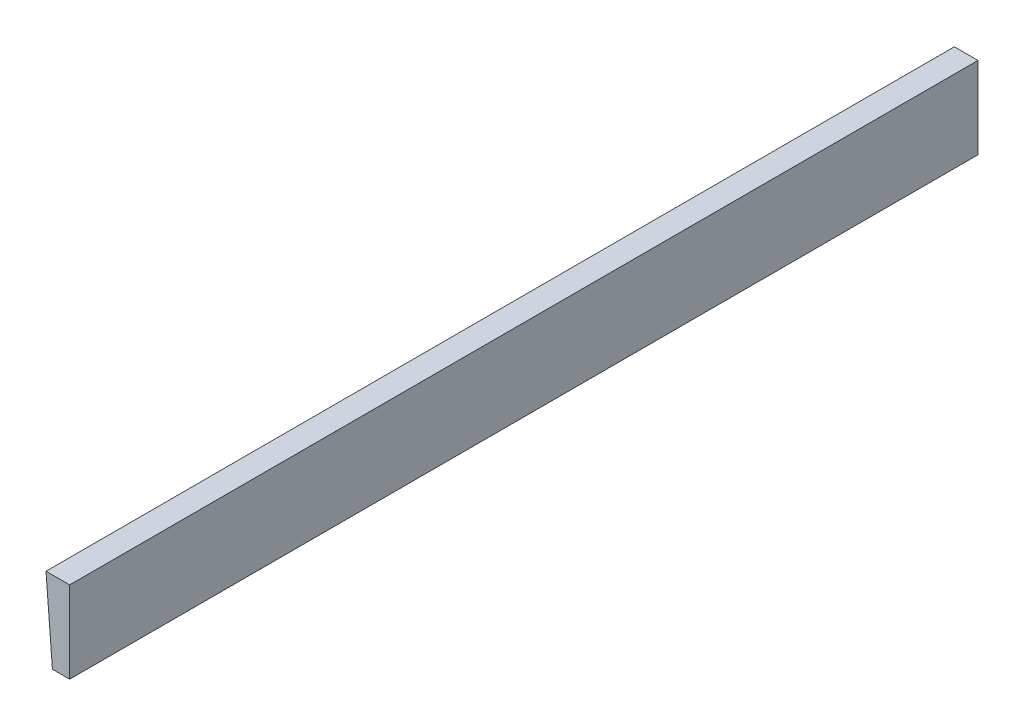
ISO-10303-21;
HEADER;
FILE_DESCRIPTION(('STEP AP214'),'2;1');
FILE_NAME('part.step','',(''),(''),'','','');
FILE_SCHEMA(('AUTOMOTIVE_DESIGN { 1 0 10303 214 1 1 1 1 }'));
ENDSEC;
DATA;
#1=APPLICATION_CONTEXT('core data for automotive mechanical design processes');
#2=APPLICATION_PROTOCOL_DEFINITION('international standard','automotive_design',2000,#1);
#3=PRODUCT_CONTEXT('',#1,'mechanical');
#4=PRODUCT('Part','Part','',(#3));
#5=PRODUCT_RELATED_PRODUCT_CATEGORY('part','',(#4));
#6=PRODUCT_DEFINITION_FORMATION('','',#4);
#7=PRODUCT_DEFINITION_CONTEXT('part definition',#1,'design');
#8=PRODUCT_DEFINITION('design','',#6,#7);
#9=PRODUCT_DEFINITION_SHAPE('','',#8);
#10=(LENGTH_UNIT() NAMED_UNIT(*) SI_UNIT(.MILLI.,.METRE.));
#11=(NAMED_UNIT(*) PLANE_ANGLE_UNIT() SI_UNIT($,.RADIAN.));
#12=(NAMED_UNIT(*) SI_UNIT($,.STERADIAN.) SOLID_ANGLE_UNIT());
#13=UNCERTAINTY_MEASURE_WITH_UNIT(LENGTH_MEASURE(1.E-05),#10,'distance_accuracy_value','');
#14=(GEOMETRIC_REPRESENTATION_CONTEXT(3) GLOBAL_UNCERTAINTY_ASSIGNED_CONTEXT((#13)) GLOBAL_UNIT_ASSIGNED_CONTEXT((#10,
#11,#12)) REPRESENTATION_CONTEXT('',''));
#15=CARTESIAN_POINT('',(0.,0.,0.));
#16=DIRECTION('',(0.,0.,1.));
#17=DIRECTION('',(1.,0.,0.));
#18=AXIS2_PLACEMENT_3D('',#15,#16,#17);
#19=CARTESIAN_POINT('',(0.,0.,-111.1875));
#20=DIRECTION('',(1.,0.,0.));
#21=DIRECTION('',(0.,0.,-1.));
#22=AXIS2_PLACEMENT_3D('',#19,#20,#21);
#23=PLANE('',#22);
#24=DIRECTION('',(0.,1.,0.));
#25=VECTOR('',#24,1.);
#26=CARTESIAN_POINT('',(0.,0.,111.1875));
#27=LINE('',#26,#25);
#28=CARTESIAN_POINT('',(0.,0.,111.1875));
#29=VERTEX_POINT('',#28);
#30=CARTESIAN_POINT('',(0.,20.,111.1875));
#31=VERTEX_POINT('',#30);
#32=EDGE_CURVE('E99',#29,#31,#27,.T.);
#33=ORIENTED_EDGE('',*,*,#32,.F.);
#34=DIRECTION('',(0.,0.,1.));
#35=VECTOR('',#34,1.);
#36=CARTESIAN_POINT('',(0.,0.,-111.1875));
#37=LINE('',#36,#35);
#38=CARTESIAN_POINT('',(0.,0.,-111.1875));
#39=VERTEX_POINT('',#38);
#40=EDGE_CURVE('E11',#39,#29,#37,.T.);
#41=ORIENTED_EDGE('',*,*,#40,.F.);
#42=DIRECTION('',(0.,1.,0.));
#43=VECTOR('',#42,1.);
#44=CARTESIAN_POINT('',(0.,10.,-111.1875));
#45=LINE('',#44,#43);
#46=CARTESIAN_POINT('',(0.,20.,-111.1875));
#47=VERTEX_POINT('',#46);
#48=EDGE_CURVE('E58',#39,#47,#45,.T.);
#49=ORIENTED_EDGE('',*,*,#48,.T.);
#50=DIRECTION('',(0.,0.,1.));
#51=VECTOR('',#50,1.);
#52=CARTESIAN_POINT('',(0.,20.,-111.1875));
#53=LINE('',#52,#51);
#54=EDGE_CURVE('E43',#47,#31,#53,.T.);
#55=ORIENTED_EDGE('',*,*,#54,.T.);
#56=EDGE_LOOP('',(#33,#41,#49,#55));
#57=FACE_BOUND('',#56,.T.);
#58=ADVANCED_FACE('F39',(#57),#23,.T.);
#59=CARTESIAN_POINT('',(-4.21298293175389,0.,-111.1875));
#60=DIRECTION('',(0.,-1.,0.));
#61=DIRECTION('',(1.,0.,0.));
#62=AXIS2_PLACEMENT_3D('',#59,#60,#61);
#63=PLANE('',#62);
#64=DIRECTION('',(1.,0.,0.));
#65=VECTOR('',#64,1.);
#66=CARTESIAN_POINT('',(-4.21298293175389,0.,111.1875));
#67=LINE('',#66,#65);
#68=CARTESIAN_POINT('',(-4.21298293175389,0.,111.1875));
#69=VERTEX_POINT('',#68);
#70=EDGE_CURVE('E106',#69,#29,#67,.T.);
#71=ORIENTED_EDGE('',*,*,#70,.F.);
#72=DIRECTION('',(0.,0.,1.));
#73=VECTOR('',#72,1.);
#74=CARTESIAN_POINT('',(-4.21298293175389,0.,-111.1875));
#75=LINE('',#74,#73);
#76=CARTESIAN_POINT('',(-4.21298293175389,0.,-111.1875));
#77=VERTEX_POINT('',#76);
#78=EDGE_CURVE('E49',#77,#69,#75,.T.);
#79=ORIENTED_EDGE('',*,*,#78,.F.);
#80=DIRECTION('',(1.,0.,0.));
#81=VECTOR('',#80,1.);
#82=CARTESIAN_POINT('',(-4.21298293175389,0.,-111.1875));
#83=LINE('',#82,#81);
#84=EDGE_CURVE('E96',#77,#39,#83,.T.);
#85=ORIENTED_EDGE('',*,*,#84,.T.);
#86=ORIENTED_EDGE('',*,*,#40,.T.);
#87=EDGE_LOOP('',(#71,#79,#85,#86));
#88=FACE_BOUND('',#87,.T.);
#89=ADVANCED_FACE('F113',(#88),#63,.T.);
#90=CARTESIAN_POINT('',(-5.,10.,-111.1875));
#91=DIRECTION('',(-0.996917333733129,-0.0784590957278379,0.));
#92=DIRECTION('',(0.0784590957278379,-0.996917333733129,0.));
#93=AXIS2_PLACEMENT_3D('',#90,#91,#92);
#94=PLANE('',#93);
#95=DIRECTION('',(0.0784590957278379,-0.996917333733128,0.));
#96=VECTOR('',#95,1.);
#97=CARTESIAN_POINT('',(-5.,10.,111.1875));
#98=LINE('',#97,#96);
#99=CARTESIAN_POINT('',(-5.78701706824611,20.,111.1875));
#100=VERTEX_POINT('',#99);
#101=EDGE_CURVE('E92',#100,#69,#98,.T.);
#102=ORIENTED_EDGE('',*,*,#101,.F.);
#103=DIRECTION('',(0.,0.,1.));
#104=VECTOR('',#103,1.);
#105=CARTESIAN_POINT('',(-5.78701706824611,20.,-111.1875));
#106=LINE('',#105,#104);
#107=CARTESIAN_POINT('',(-5.78701706824611,20.,-111.1875));
#108=VERTEX_POINT('',#107);
#109=EDGE_CURVE('E87',#108,#100,#106,.T.);
#110=ORIENTED_EDGE('',*,*,#109,.F.);
#111=DIRECTION('',(0.0784590957278379,-0.996917333733128,0.));
#112=VECTOR('',#111,1.);
#113=CARTESIAN_POINT('',(-5.78701706824611,20.,-111.1875));
#114=LINE('',#113,#112);
#115=EDGE_CURVE('E90',#108,#77,#114,.T.);
#116=ORIENTED_EDGE('',*,*,#115,.T.);
#117=ORIENTED_EDGE('',*,*,#78,.T.);
#118=EDGE_LOOP('',(#102,#110,#116,#117));
#119=FACE_BOUND('',#118,.T.);
#120=ADVANCED_FACE('F89',(#119),#94,.T.);
#121=CARTESIAN_POINT('',(0.,20.,-111.1875));
#122=DIRECTION('',(0.,1.,0.));
#123=DIRECTION('',(0.,0.,1.));
#124=AXIS2_PLACEMENT_3D('',#121,#122,#123);
#125=PLANE('',#124);
#126=DIRECTION('',(-1.,0.,0.));
#127=VECTOR('',#126,1.);
#128=CARTESIAN_POINT('',(0.,20.,111.1875));
#129=LINE('',#128,#127);
#130=EDGE_CURVE('E103',#31,#100,#129,.T.);
#131=ORIENTED_EDGE('',*,*,#130,.F.);
#132=ORIENTED_EDGE('',*,*,#54,.F.);
#133=DIRECTION('',(-1.,0.,0.));
#134=VECTOR('',#133,1.);
#135=CARTESIAN_POINT('',(0.,20.,-111.1875));
#136=LINE('',#135,#134);
#137=EDGE_CURVE('E95',#47,#108,#136,.T.);
#138=ORIENTED_EDGE('',*,*,#137,.T.);
#139=ORIENTED_EDGE('',*,*,#109,.T.);
#140=EDGE_LOOP('',(#131,#132,#138,#139));
#141=FACE_BOUND('',#140,.T.);
#142=ADVANCED_FACE('F41',(#141),#125,.T.);
#143=CARTESIAN_POINT('',(0.,0.,-111.1875));
#144=DIRECTION('',(0.,0.,1.));
#145=DIRECTION('',(1.,0.,0.));
#146=AXIS2_PLACEMENT_3D('',#143,#144,#145);
#147=PLANE('',#146);
#148=ORIENTED_EDGE('',*,*,#48,.F.);
#149=ORIENTED_EDGE('',*,*,#84,.F.);
#150=ORIENTED_EDGE('',*,*,#115,.F.);
#151=ORIENTED_EDGE('',*,*,#137,.F.);
#152=EDGE_LOOP('',(#148,#149,#150,#151));
#153=FACE_BOUND('',#152,.T.);
#154=ADVANCED_FACE('F94',(#153),#147,.F.);
#155=CARTESIAN_POINT('',(0.,0.,111.1875));
#156=DIRECTION('',(0.,0.,1.));
#157=DIRECTION('',(1.,0.,0.));
#158=AXIS2_PLACEMENT_3D('',#155,#156,#157);
#159=PLANE('',#158);
#160=ORIENTED_EDGE('',*,*,#32,.T.);
#161=ORIENTED_EDGE('',*,*,#130,.T.);
#162=ORIENTED_EDGE('',*,*,#101,.T.);
#163=ORIENTED_EDGE('',*,*,#70,.T.);
#164=EDGE_LOOP('',(#160,#161,#162,#163));
#165=FACE_BOUND('',#164,.T.);
#166=ADVANCED_FACE('F111',(#165),#159,.T.);
#167=CLOSED_SHELL('',(#58,#89,#120,#142,#154,#166));
#168=MANIFOLD_SOLID_BREP('B2',#167);
#169=ADVANCED_BREP_SHAPE_REPRESENTATION('',(#18,#168),#14);
#170=SHAPE_DEFINITION_REPRESENTATION(#9,#169);
ENDSEC;
END-ISO-10303-21;
